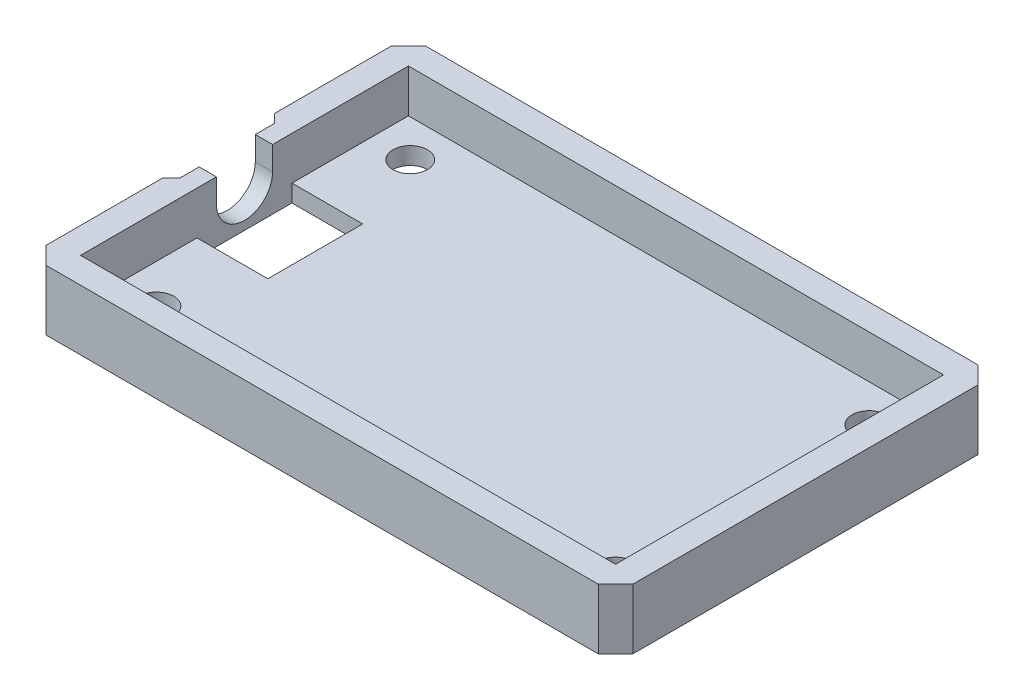
ISO-10303-21;
HEADER;
FILE_DESCRIPTION(('STEP AP214'),'2;1');
FILE_NAME('part.step','',(''),(''),'','','');
FILE_SCHEMA(('AUTOMOTIVE_DESIGN { 1 0 10303 214 1 1 1 1 }'));
ENDSEC;
DATA;
#1=APPLICATION_CONTEXT('core data for automotive mechanical design processes');
#2=APPLICATION_PROTOCOL_DEFINITION('international standard','automotive_design',2000,#1);
#3=PRODUCT_CONTEXT('',#1,'mechanical');
#4=PRODUCT('Part','Part','',(#3));
#5=PRODUCT_RELATED_PRODUCT_CATEGORY('part','',(#4));
#6=PRODUCT_DEFINITION_FORMATION('','',#4);
#7=PRODUCT_DEFINITION_CONTEXT('part definition',#1,'design');
#8=PRODUCT_DEFINITION('design','',#6,#7);
#9=PRODUCT_DEFINITION_SHAPE('','',#8);
#10=(LENGTH_UNIT() NAMED_UNIT(*) SI_UNIT(.MILLI.,.METRE.));
#11=(NAMED_UNIT(*) PLANE_ANGLE_UNIT() SI_UNIT($,.RADIAN.));
#12=(NAMED_UNIT(*) SI_UNIT($,.STERADIAN.) SOLID_ANGLE_UNIT());
#13=UNCERTAINTY_MEASURE_WITH_UNIT(LENGTH_MEASURE(1.E-05),#10,'distance_accuracy_value','');
#14=(GEOMETRIC_REPRESENTATION_CONTEXT(3) GLOBAL_UNCERTAINTY_ASSIGNED_CONTEXT((#13)) GLOBAL_UNIT_ASSIGNED_CONTEXT((#10,
#11,#12)) REPRESENTATION_CONTEXT('',''));
#15=CARTESIAN_POINT('',(0.,0.,0.));
#16=DIRECTION('',(0.,0.,1.));
#17=DIRECTION('',(1.,0.,0.));
#18=AXIS2_PLACEMENT_3D('',#15,#16,#17);
#19=CARTESIAN_POINT('',(-36.2840909090909,5.,14.3181818181818));
#20=DIRECTION('',(0.,0.,1.));
#21=DIRECTION('',(1.,0.,0.));
#22=AXIS2_PLACEMENT_3D('',#19,#20,#21);
#23=PLANE('',#22);
#24=DIRECTION('',(0.,-1.,0.));
#25=VECTOR('',#24,1.);
#26=CARTESIAN_POINT('',(-33.2840909090909,5.,14.3181818181818));
#27=LINE('',#26,#25);
#28=CARTESIAN_POINT('',(-33.2840909090909,0.,14.3181818181818));
#29=VERTEX_POINT('',#28);
#30=CARTESIAN_POINT('',(-33.2840909090909,-2.,14.3181818181818));
#31=VERTEX_POINT('',#30);
#32=EDGE_CURVE('E223',#29,#31,#27,.T.);
#33=ORIENTED_EDGE('',*,*,#32,.F.);
#34=DIRECTION('',(-1.,0.,0.));
#35=VECTOR('',#34,1.);
#36=CARTESIAN_POINT('',(-25.0840909090909,0.,14.3181818181818));
#37=LINE('',#36,#35);
#38=CARTESIAN_POINT('',(-25.0840909090909,0.,14.3181818181818));
#39=VERTEX_POINT('',#38);
#40=EDGE_CURVE('E269',#39,#29,#37,.T.);
#41=ORIENTED_EDGE('',*,*,#40,.F.);
#42=DIRECTION('',(0.,1.,0.));
#43=VECTOR('',#42,1.);
#44=CARTESIAN_POINT('',(-25.0840909090909,0.,14.3181818181818));
#45=LINE('',#44,#43);
#46=CARTESIAN_POINT('',(-25.0840909090909,-2.,14.3181818181818));
#47=VERTEX_POINT('',#46);
#48=EDGE_CURVE('E259',#47,#39,#45,.T.);
#49=ORIENTED_EDGE('',*,*,#48,.F.);
#50=DIRECTION('',(-1.,0.,0.));
#51=VECTOR('',#50,1.);
#52=CARTESIAN_POINT('',(-25.0840909090909,-2.,14.3181818181818));
#53=LINE('',#52,#51);
#54=EDGE_CURVE('E272',#47,#31,#53,.T.);
#55=ORIENTED_EDGE('',*,*,#54,.T.);
#56=EDGE_LOOP('',(#33,#41,#49,#55));
#57=FACE_BOUND('',#56,.T.);
#58=ADVANCED_FACE('F33',(#57),#23,.F.);
#59=CARTESIAN_POINT('',(-36.2840909090909,5.,3.31818181818182));
#60=DIRECTION('',(0.,0.,-1.));
#61=DIRECTION('',(-1.,0.,0.));
#62=AXIS2_PLACEMENT_3D('',#59,#60,#61);
#63=PLANE('',#62);
#64=DIRECTION('',(0.,1.,0.));
#65=VECTOR('',#64,1.);
#66=CARTESIAN_POINT('',(-33.2840909090909,5.,3.31818181818182));
#67=LINE('',#66,#65);
#68=CARTESIAN_POINT('',(-33.2840909090909,-2.,3.31818181818182));
#69=VERTEX_POINT('',#68);
#70=CARTESIAN_POINT('',(-33.2840909090909,0.,3.31818181818182));
#71=VERTEX_POINT('',#70);
#72=EDGE_CURVE('E236',#69,#71,#67,.T.);
#73=ORIENTED_EDGE('',*,*,#72,.F.);
#74=DIRECTION('',(-1.,0.,0.));
#75=VECTOR('',#74,1.);
#76=CARTESIAN_POINT('',(-25.0840909090909,-2.,3.31818181818182));
#77=LINE('',#76,#75);
#78=CARTESIAN_POINT('',(-25.0840909090909,-2.,3.31818181818182));
#79=VERTEX_POINT('',#78);
#80=EDGE_CURVE('E265',#79,#69,#77,.T.);
#81=ORIENTED_EDGE('',*,*,#80,.F.);
#82=DIRECTION('',(0.,-1.,0.));
#83=VECTOR('',#82,1.);
#84=CARTESIAN_POINT('',(-25.0840909090909,0.,3.31818181818182));
#85=LINE('',#84,#83);
#86=CARTESIAN_POINT('',(-25.0840909090909,0.,3.31818181818182));
#87=VERTEX_POINT('',#86);
#88=EDGE_CURVE('E254',#87,#79,#85,.T.);
#89=ORIENTED_EDGE('',*,*,#88,.F.);
#90=DIRECTION('',(-1.,0.,0.));
#91=VECTOR('',#90,1.);
#92=CARTESIAN_POINT('',(-25.0840909090909,0.,3.31818181818182));
#93=LINE('',#92,#91);
#94=EDGE_CURVE('E266',#87,#71,#93,.T.);
#95=ORIENTED_EDGE('',*,*,#94,.T.);
#96=EDGE_LOOP('',(#73,#81,#89,#95));
#97=FACE_BOUND('',#96,.T.);
#98=ADVANCED_FACE('F474',(#97),#63,.F.);
#99=CARTESIAN_POINT('',(-36.2840909090909,5.,-13.1818181818182));
#100=DIRECTION('',(1.,0.,0.));
#101=DIRECTION('',(0.,0.,-1.));
#102=AXIS2_PLACEMENT_3D('',#99,#100,#101);
#103=PLANE('',#102);
#104=DIRECTION('',(0.,0.,1.));
#105=VECTOR('',#104,1.);
#106=CARTESIAN_POINT('',(-36.2840909090909,5.,-13.1818181818182));
#107=LINE('',#106,#105);
#108=CARTESIAN_POINT('',(-36.2840909090909,5.,-11.1818181818182));
#109=VERTEX_POINT('',#108);
#110=CARTESIAN_POINT('',(-36.2840909090909,5.,2.3181818181818));
#111=VERTEX_POINT('',#110);
#112=EDGE_CURVE('E305',#109,#111,#107,.T.);
#113=ORIENTED_EDGE('',*,*,#112,.F.);
#114=DIRECTION('',(0.,-1.,0.));
#115=VECTOR('',#114,1.);
#116=CARTESIAN_POINT('',(-36.2840909090909,5.,-11.1818181818182));
#117=LINE('',#116,#115);
#118=CARTESIAN_POINT('',(-36.2840909090909,-2.,-11.1818181818182));
#119=VERTEX_POINT('',#118);
#120=EDGE_CURVE('E350',#109,#119,#117,.T.);
#121=ORIENTED_EDGE('',*,*,#120,.T.);
#122=DIRECTION('',(0.,0.,-1.));
#123=VECTOR('',#122,1.);
#124=CARTESIAN_POINT('',(-36.2840909090909,-2.,-13.1818181818182));
#125=LINE('',#124,#123);
#126=CARTESIAN_POINT('',(-36.2840909090909,-2.,2.3181818181818));
#127=VERTEX_POINT('',#126);
#128=EDGE_CURVE('E268',#127,#119,#125,.T.);
#129=ORIENTED_EDGE('',*,*,#128,.F.);
#130=DIRECTION('',(0.,1.,0.));
#131=VECTOR('',#130,1.);
#132=CARTESIAN_POINT('',(-36.2840909090909,5.,2.3181818181818));
#133=LINE('',#132,#131);
#134=EDGE_CURVE('E347',#127,#111,#133,.T.);
#135=ORIENTED_EDGE('',*,*,#134,.T.);
#136=EDGE_LOOP('',(#113,#121,#129,#135));
#137=FACE_BOUND('',#136,.T.);
#138=ADVANCED_FACE('F419',(#137),#103,.F.);
#139=CARTESIAN_POINT('',(-33.2840909090909,5.,-10.1818181818182));
#140=DIRECTION('',(0.,0.,-1.));
#141=DIRECTION('',(-1.,0.,0.));
#142=AXIS2_PLACEMENT_3D('',#139,#140,#141);
#143=PLANE('',#142);
#144=DIRECTION('',(1.,0.,0.));
#145=VECTOR('',#144,1.);
#146=CARTESIAN_POINT('',(-33.2840909090909,0.,-10.1818181818182));
#147=LINE('',#146,#145);
#148=CARTESIAN_POINT('',(-33.2840909090909,0.,-10.1818181818182));
#149=VERTEX_POINT('',#148);
#150=CARTESIAN_POINT('',(28.7159090909091,0.,-10.1818181818182));
#151=VERTEX_POINT('',#150);
#152=EDGE_CURVE('E309',#149,#151,#147,.T.);
#153=ORIENTED_EDGE('',*,*,#152,.T.);
#154=DIRECTION('',(0.,-1.,0.));
#155=VECTOR('',#154,1.);
#156=CARTESIAN_POINT('',(28.7159090909091,5.,-10.1818181818182));
#157=LINE('',#156,#155);
#158=CARTESIAN_POINT('',(28.7159090909091,5.,-10.1818181818182));
#159=VERTEX_POINT('',#158);
#160=EDGE_CURVE('E326',#159,#151,#157,.T.);
#161=ORIENTED_EDGE('',*,*,#160,.F.);
#162=DIRECTION('',(1.,0.,0.));
#163=VECTOR('',#162,1.);
#164=CARTESIAN_POINT('',(-33.2840909090909,5.,-10.1818181818182));
#165=LINE('',#164,#163);
#166=CARTESIAN_POINT('',(-33.2840909090909,5.,-10.1818181818182));
#167=VERTEX_POINT('',#166);
#168=EDGE_CURVE('E289',#167,#159,#165,.T.);
#169=ORIENTED_EDGE('',*,*,#168,.F.);
#170=DIRECTION('',(0.,-1.,0.));
#171=VECTOR('',#170,1.);
#172=CARTESIAN_POINT('',(-33.2840909090909,5.,-10.1818181818182));
#173=LINE('',#172,#171);
#174=EDGE_CURVE('E329',#167,#149,#173,.T.);
#175=ORIENTED_EDGE('',*,*,#174,.T.);
#176=EDGE_LOOP('',(#153,#161,#169,#175));
#177=FACE_BOUND('',#176,.T.);
#178=ADVANCED_FACE('F444',(#177),#143,.F.);
#179=CARTESIAN_POINT('',(28.7159090909091,5.,-10.1818181818182));
#180=DIRECTION('',(1.,0.,0.));
#181=DIRECTION('',(0.,0.,-1.));
#182=AXIS2_PLACEMENT_3D('',#179,#180,#181);
#183=PLANE('',#182);
#184=DIRECTION('',(0.,0.,1.));
#185=VECTOR('',#184,1.);
#186=CARTESIAN_POINT('',(28.7159090909091,0.,-10.1818181818182));
#187=LINE('',#186,#185);
#188=CARTESIAN_POINT('',(28.7159090909091,0.,27.8181818181818));
#189=VERTEX_POINT('',#188);
#190=EDGE_CURVE('E312',#151,#189,#187,.T.);
#191=ORIENTED_EDGE('',*,*,#190,.T.);
#192=DIRECTION('',(0.,-1.,0.));
#193=VECTOR('',#192,1.);
#194=CARTESIAN_POINT('',(28.7159090909091,5.,27.8181818181818));
#195=LINE('',#194,#193);
#196=CARTESIAN_POINT('',(28.7159090909091,5.,27.8181818181818));
#197=VERTEX_POINT('',#196);
#198=EDGE_CURVE('E323',#197,#189,#195,.T.);
#199=ORIENTED_EDGE('',*,*,#198,.F.);
#200=DIRECTION('',(0.,0.,1.));
#201=VECTOR('',#200,1.);
#202=CARTESIAN_POINT('',(28.7159090909091,5.,-10.1818181818182));
#203=LINE('',#202,#201);
#204=EDGE_CURVE('E292',#159,#197,#203,.T.);
#205=ORIENTED_EDGE('',*,*,#204,.F.);
#206=ORIENTED_EDGE('',*,*,#160,.T.);
#207=EDGE_LOOP('',(#191,#199,#205,#206));
#208=FACE_BOUND('',#207,.T.);
#209=ADVANCED_FACE('F451',(#208),#183,.F.);
#210=CARTESIAN_POINT('',(-33.2840909090909,5.,27.8181818181818));
#211=DIRECTION('',(0.,0.,1.));
#212=DIRECTION('',(1.,0.,0.));
#213=AXIS2_PLACEMENT_3D('',#210,#211,#212);
#214=PLANE('',#213);
#215=DIRECTION('',(-1.,0.,0.));
#216=VECTOR('',#215,1.);
#217=CARTESIAN_POINT('',(-33.2840909090909,0.,27.8181818181818));
#218=LINE('',#217,#216);
#219=CARTESIAN_POINT('',(-33.2840909090909,0.,27.8181818181818));
#220=VERTEX_POINT('',#219);
#221=EDGE_CURVE('E315',#189,#220,#218,.T.);
#222=ORIENTED_EDGE('',*,*,#221,.T.);
#223=DIRECTION('',(0.,-1.,0.));
#224=VECTOR('',#223,1.);
#225=CARTESIAN_POINT('',(-33.2840909090909,5.,27.8181818181818));
#226=LINE('',#225,#224);
#227=CARTESIAN_POINT('',(-33.2840909090909,5.,27.8181818181818));
#228=VERTEX_POINT('',#227);
#229=EDGE_CURVE('E307',#228,#220,#226,.T.);
#230=ORIENTED_EDGE('',*,*,#229,.F.);
#231=DIRECTION('',(-1.,0.,0.));
#232=VECTOR('',#231,1.);
#233=CARTESIAN_POINT('',(-33.2840909090909,5.,27.8181818181818));
#234=LINE('',#233,#232);
#235=EDGE_CURVE('E294',#197,#228,#234,.T.);
#236=ORIENTED_EDGE('',*,*,#235,.F.);
#237=ORIENTED_EDGE('',*,*,#198,.T.);
#238=EDGE_LOOP('',(#222,#230,#236,#237));
#239=FACE_BOUND('',#238,.T.);
#240=ADVANCED_FACE('F453',(#239),#214,.F.);
#241=CARTESIAN_POINT('',(-33.2840909090909,5.,14.3181818181818));
#242=DIRECTION('',(-1.,0.,0.));
#243=DIRECTION('',(0.,0.,1.));
#244=AXIS2_PLACEMENT_3D('',#241,#242,#243);
#245=PLANE('',#244);
#246=DIRECTION('',(0.,0.,-1.));
#247=VECTOR('',#246,1.);
#248=CARTESIAN_POINT('',(-33.2840909090909,5.,-10.1818181818182));
#249=LINE('',#248,#247);
#250=CARTESIAN_POINT('',(-33.2840909090909,5.,5.56818181818181));
#251=VERTEX_POINT('',#250);
#252=EDGE_CURVE('E290',#251,#167,#249,.T.);
#253=ORIENTED_EDGE('',*,*,#252,.F.);
#254=DIRECTION('',(0.,-1.,0.));
#255=VECTOR('',#254,1.);
#256=CARTESIAN_POINT('',(-33.2840909090909,5.,5.56818181818181));
#257=LINE('',#256,#255);
#258=CARTESIAN_POINT('',(-33.2840909090909,2.25,5.56818181818181));
#259=VERTEX_POINT('',#258);
#260=EDGE_CURVE('E440',#251,#259,#257,.T.);
#261=ORIENTED_EDGE('',*,*,#260,.T.);
#262=CARTESIAN_POINT('',(-33.2840909090909,2.25,8.81818181818181));
#263=DIRECTION('',(-1.,0.,0.));
#264=DIRECTION('',(0.,0.,1.));
#265=AXIS2_PLACEMENT_3D('',#262,#263,#264);
#266=CIRCLE('',#265,3.25);
#267=CARTESIAN_POINT('',(-33.2840909090909,2.25,12.0681818181818));
#268=VERTEX_POINT('',#267);
#269=EDGE_CURVE('E228',#259,#268,#266,.T.);
#270=ORIENTED_EDGE('',*,*,#269,.T.);
#271=DIRECTION('',(0.,1.,0.));
#272=VECTOR('',#271,1.);
#273=CARTESIAN_POINT('',(-33.2840909090909,5.,12.0681818181818));
#274=LINE('',#273,#272);
#275=CARTESIAN_POINT('',(-33.2840909090909,5.,12.0681818181818));
#276=VERTEX_POINT('',#275);
#277=EDGE_CURVE('E454',#268,#276,#274,.T.);
#278=ORIENTED_EDGE('',*,*,#277,.T.);
#279=EDGE_CURVE('E214',#228,#276,#249,.T.);
#280=ORIENTED_EDGE('',*,*,#279,.F.);
#281=ORIENTED_EDGE('',*,*,#229,.T.);
#282=DIRECTION('',(0.,0.,-1.));
#283=VECTOR('',#282,1.);
#284=CARTESIAN_POINT('',(-33.2840909090909,0.,14.3181818181818));
#285=LINE('',#284,#283);
#286=EDGE_CURVE('E318',#220,#29,#285,.T.);
#287=ORIENTED_EDGE('',*,*,#286,.T.);
#288=ORIENTED_EDGE('',*,*,#32,.T.);
#289=DIRECTION('',(0.,0.,1.));
#290=VECTOR('',#289,1.);
#291=CARTESIAN_POINT('',(-33.2840909090909,-2.,-5.68181818181819));
#292=LINE('',#291,#290);
#293=EDGE_CURVE('E233',#69,#31,#292,.T.);
#294=ORIENTED_EDGE('',*,*,#293,.F.);
#295=ORIENTED_EDGE('',*,*,#72,.T.);
#296=DIRECTION('',(0.,0.,-1.));
#297=VECTOR('',#296,1.);
#298=CARTESIAN_POINT('',(-33.2840909090909,0.,-10.1818181818182));
#299=LINE('',#298,#297);
#300=EDGE_CURVE('E287',#71,#149,#299,.T.);
#301=ORIENTED_EDGE('',*,*,#300,.T.);
#302=ORIENTED_EDGE('',*,*,#174,.F.);
#303=EDGE_LOOP('',(#253,#261,#270,#278,#280,#281,#287,#288,#294,#295,#301,#302));
#304=FACE_BOUND('',#303,.T.);
#305=ADVANCED_FACE('F438',(#304),#245,.F.);
#306=CARTESIAN_POINT('',(-36.2840909090909,5.,30.8181818181818));
#307=DIRECTION('',(0.,0.,-1.));
#308=DIRECTION('',(-1.,0.,0.));
#309=AXIS2_PLACEMENT_3D('',#306,#307,#308);
#310=PLANE('',#309);
#311=DIRECTION('',(-1.,0.,0.));
#312=VECTOR('',#311,1.);
#313=CARTESIAN_POINT('',(-36.2840909090909,-2.,30.8181818181818));
#314=LINE('',#313,#312);
#315=CARTESIAN_POINT('',(29.7159090909091,-2.,30.8181818181818));
#316=VERTEX_POINT('',#315);
#317=CARTESIAN_POINT('',(-34.2840909090909,-2.,30.8181818181818));
#318=VERTEX_POINT('',#317);
#319=EDGE_CURVE('E284',#316,#318,#314,.T.);
#320=ORIENTED_EDGE('',*,*,#319,.F.);
#321=DIRECTION('',(0.,1.,0.));
#322=VECTOR('',#321,1.);
#323=CARTESIAN_POINT('',(29.7159090909091,5.,30.8181818181818));
#324=LINE('',#323,#322);
#325=CARTESIAN_POINT('',(29.7159090909091,5.,30.8181818181818));
#326=VERTEX_POINT('',#325);
#327=EDGE_CURVE('E41',#316,#326,#324,.T.);
#328=ORIENTED_EDGE('',*,*,#327,.T.);
#329=DIRECTION('',(1.,0.,0.));
#330=VECTOR('',#329,1.);
#331=CARTESIAN_POINT('',(-36.2840909090909,5.,30.8181818181818));
#332=LINE('',#331,#330);
#333=CARTESIAN_POINT('',(-34.2840909090909,5.,30.8181818181818));
#334=VERTEX_POINT('',#333);
#335=EDGE_CURVE('E299',#334,#326,#332,.T.);
#336=ORIENTED_EDGE('',*,*,#335,.F.);
#337=DIRECTION('',(0.,-1.,0.));
#338=VECTOR('',#337,1.);
#339=CARTESIAN_POINT('',(-34.2840909090909,5.,30.8181818181818));
#340=LINE('',#339,#338);
#341=EDGE_CURVE('E386',#334,#318,#340,.T.);
#342=ORIENTED_EDGE('',*,*,#341,.T.);
#343=EDGE_LOOP('',(#320,#328,#336,#342));
#344=FACE_BOUND('',#343,.T.);
#345=ADVANCED_FACE('F392',(#344),#310,.F.);
#346=CARTESIAN_POINT('',(31.7159090909091,5.,-13.1818181818182));
#347=DIRECTION('',(-1.,0.,0.));
#348=DIRECTION('',(0.,0.,1.));
#349=AXIS2_PLACEMENT_3D('',#346,#347,#348);
#350=PLANE('',#349);
#351=DIRECTION('',(0.,0.,1.));
#352=VECTOR('',#351,1.);
#353=CARTESIAN_POINT('',(31.7159090909091,-2.,-13.1818181818182));
#354=LINE('',#353,#352);
#355=CARTESIAN_POINT('',(31.7159090909091,-2.,-11.1818181818182));
#356=VERTEX_POINT('',#355);
#357=CARTESIAN_POINT('',(31.7159090909091,-2.,28.8181818181818));
#358=VERTEX_POINT('',#357);
#359=EDGE_CURVE('E281',#356,#358,#354,.T.);
#360=ORIENTED_EDGE('',*,*,#359,.F.);
#361=DIRECTION('',(0.,1.,0.));
#362=VECTOR('',#361,1.);
#363=CARTESIAN_POINT('',(31.7159090909091,5.,-11.1818181818182));
#364=LINE('',#363,#362);
#365=CARTESIAN_POINT('',(31.7159090909091,5.,-11.1818181818182));
#366=VERTEX_POINT('',#365);
#367=EDGE_CURVE('E48',#356,#366,#364,.T.);
#368=ORIENTED_EDGE('',*,*,#367,.T.);
#369=DIRECTION('',(0.,0.,-1.));
#370=VECTOR('',#369,1.);
#371=CARTESIAN_POINT('',(31.7159090909091,5.,-13.1818181818182));
#372=LINE('',#371,#370);
#373=CARTESIAN_POINT('',(31.7159090909091,5.,28.8181818181818));
#374=VERTEX_POINT('',#373);
#375=EDGE_CURVE('E301',#374,#366,#372,.T.);
#376=ORIENTED_EDGE('',*,*,#375,.F.);
#377=DIRECTION('',(0.,-1.,0.));
#378=VECTOR('',#377,1.);
#379=CARTESIAN_POINT('',(31.7159090909091,5.,28.8181818181818));
#380=LINE('',#379,#378);
#381=EDGE_CURVE('E382',#374,#358,#380,.T.);
#382=ORIENTED_EDGE('',*,*,#381,.T.);
#383=EDGE_LOOP('',(#360,#368,#376,#382));
#384=FACE_BOUND('',#383,.T.);
#385=ADVANCED_FACE('F398',(#384),#350,.F.);
#386=CARTESIAN_POINT('',(-36.2840909090909,5.,-13.1818181818182));
#387=DIRECTION('',(0.,0.,1.));
#388=DIRECTION('',(1.,0.,0.));
#389=AXIS2_PLACEMENT_3D('',#386,#387,#388);
#390=PLANE('',#389);
#391=DIRECTION('',(1.,0.,0.));
#392=VECTOR('',#391,1.);
#393=CARTESIAN_POINT('',(-36.2840909090909,-2.,-13.1818181818182));
#394=LINE('',#393,#392);
#395=CARTESIAN_POINT('',(-34.2840909090909,-2.,-13.1818181818182));
#396=VERTEX_POINT('',#395);
#397=CARTESIAN_POINT('',(29.7159090909091,-2.,-13.1818181818182));
#398=VERTEX_POINT('',#397);
#399=EDGE_CURVE('E278',#396,#398,#394,.T.);
#400=ORIENTED_EDGE('',*,*,#399,.F.);
#401=DIRECTION('',(0.,1.,0.));
#402=VECTOR('',#401,1.);
#403=CARTESIAN_POINT('',(-34.2840909090909,5.,-13.1818181818182));
#404=LINE('',#403,#402);
#405=CARTESIAN_POINT('',(-34.2840909090909,5.,-13.1818181818182));
#406=VERTEX_POINT('',#405);
#407=EDGE_CURVE('E373',#396,#406,#404,.T.);
#408=ORIENTED_EDGE('',*,*,#407,.T.);
#409=DIRECTION('',(-1.,0.,0.));
#410=VECTOR('',#409,1.);
#411=CARTESIAN_POINT('',(-36.2840909090909,5.,-13.1818181818182));
#412=LINE('',#411,#410);
#413=CARTESIAN_POINT('',(29.7159090909091,5.,-13.1818181818182));
#414=VERTEX_POINT('',#413);
#415=EDGE_CURVE('E303',#414,#406,#412,.T.);
#416=ORIENTED_EDGE('',*,*,#415,.F.);
#417=DIRECTION('',(0.,-1.,0.));
#418=VECTOR('',#417,1.);
#419=CARTESIAN_POINT('',(29.7159090909091,5.,-13.1818181818182));
#420=LINE('',#419,#418);
#421=EDGE_CURVE('E370',#414,#398,#420,.T.);
#422=ORIENTED_EDGE('',*,*,#421,.T.);
#423=EDGE_LOOP('',(#400,#408,#416,#422));
#424=FACE_BOUND('',#423,.T.);
#425=ADVANCED_FACE('F410',(#424),#390,.F.);
#426=CARTESIAN_POINT('',(-36.2840909090909,-2.,28.8181818181818));
#427=VERTEX_POINT('',#426);
#428=CARTESIAN_POINT('',(-36.2840909090909,-2.,15.3181818181818));
#429=VERTEX_POINT('',#428);
#430=EDGE_CURVE('E276',#427,#429,#125,.T.);
#431=ORIENTED_EDGE('',*,*,#430,.F.);
#432=DIRECTION('',(0.,1.,0.));
#433=VECTOR('',#432,1.);
#434=CARTESIAN_POINT('',(-36.2840909090909,5.,28.8181818181818));
#435=LINE('',#434,#433);
#436=CARTESIAN_POINT('',(-36.2840909090909,5.,28.8181818181818));
#437=VERTEX_POINT('',#436);
#438=EDGE_CURVE('E11',#427,#437,#435,.T.);
#439=ORIENTED_EDGE('',*,*,#438,.T.);
#440=DIRECTION('',(0.,0.,1.));
#441=VECTOR('',#440,1.);
#442=CARTESIAN_POINT('',(-36.2840909090909,5.,14.3181818181818));
#443=LINE('',#442,#441);
#444=CARTESIAN_POINT('',(-36.2840909090909,5.,15.3181818181818));
#445=VERTEX_POINT('',#444);
#446=EDGE_CURVE('E296',#445,#437,#443,.T.);
#447=ORIENTED_EDGE('',*,*,#446,.F.);
#448=DIRECTION('',(0.,-1.,0.));
#449=VECTOR('',#448,1.);
#450=CARTESIAN_POINT('',(-36.2840909090909,5.,15.3181818181818));
#451=LINE('',#450,#449);
#452=EDGE_CURVE('E332',#445,#429,#451,.T.);
#453=ORIENTED_EDGE('',*,*,#452,.T.);
#454=EDGE_LOOP('',(#431,#439,#447,#453));
#455=FACE_BOUND('',#454,.T.);
#456=ADVANCED_FACE('F515',(#455),#103,.F.);
#457=CARTESIAN_POINT('',(0.,5.,0.));
#458=DIRECTION('',(0.,1.,0.));
#459=DIRECTION('',(0.,0.,1.));
#460=AXIS2_PLACEMENT_3D('',#457,#458,#459);
#461=PLANE('',#460);
#462=ORIENTED_EDGE('',*,*,#415,.T.);
#463=DIRECTION('',(0.707106781186548,0.,-0.707106781186548));
#464=VECTOR('',#463,1.);
#465=CARTESIAN_POINT('',(-23.7329545454545,5.,-23.7329545454545));
#466=LINE('',#465,#464);
#467=EDGE_CURVE('E380',#406,#109,#466,.F.);
#468=ORIENTED_EDGE('',*,*,#467,.T.);
#469=ORIENTED_EDGE('',*,*,#112,.T.);
#470=DIRECTION('',(-0.707106781186543,0.,-0.707106781186552));
#471=VECTOR('',#470,1.);
#472=CARTESIAN_POINT('',(-19.3011363636366,5.,19.3011363636363));
#473=LINE('',#472,#471);
#474=CARTESIAN_POINT('',(-35.2840909090909,5.,3.31818181818182));
#475=VERTEX_POINT('',#474);
#476=EDGE_CURVE('E340',#111,#475,#473,.F.);
#477=ORIENTED_EDGE('',*,*,#476,.T.);
#478=DIRECTION('',(0.,0.,1.));
#479=VECTOR('',#478,1.);
#480=CARTESIAN_POINT('',(-35.2840909090909,5.,-5.68181818181819));
#481=LINE('',#480,#479);
#482=CARTESIAN_POINT('',(-35.2840909090909,5.,5.56818181818181));
#483=VERTEX_POINT('',#482);
#484=EDGE_CURVE('E222',#475,#483,#481,.T.);
#485=ORIENTED_EDGE('',*,*,#484,.T.);
#486=DIRECTION('',(-1.,0.,0.));
#487=VECTOR('',#486,1.);
#488=CARTESIAN_POINT('',(-30.2840909090909,5.,5.56818181818181));
#489=LINE('',#488,#487);
#490=EDGE_CURVE('E215',#251,#483,#489,.T.);
#491=ORIENTED_EDGE('',*,*,#490,.F.);
#492=ORIENTED_EDGE('',*,*,#252,.T.);
#493=ORIENTED_EDGE('',*,*,#168,.T.);
#494=ORIENTED_EDGE('',*,*,#204,.T.);
#495=ORIENTED_EDGE('',*,*,#235,.T.);
#496=ORIENTED_EDGE('',*,*,#279,.T.);
#497=DIRECTION('',(-1.,0.,0.));
#498=VECTOR('',#497,1.);
#499=CARTESIAN_POINT('',(-30.2840909090909,5.,12.0681818181818));
#500=LINE('',#499,#498);
#501=CARTESIAN_POINT('',(-35.2840909090909,5.,12.0681818181818));
#502=VERTEX_POINT('',#501);
#503=EDGE_CURVE('E198',#276,#502,#500,.T.);
#504=ORIENTED_EDGE('',*,*,#503,.T.);
#505=CARTESIAN_POINT('',(-35.2840909090909,5.,14.3181818181818));
#506=VERTEX_POINT('',#505);
#507=EDGE_CURVE('E211',#502,#506,#481,.T.);
#508=ORIENTED_EDGE('',*,*,#507,.T.);
#509=DIRECTION('',(0.707106781186548,0.,-0.707106781186547));
#510=VECTOR('',#509,1.);
#511=CARTESIAN_POINT('',(-10.4829545454545,5.,-10.4829545454545));
#512=LINE('',#511,#510);
#513=EDGE_CURVE('E342',#506,#445,#512,.F.);
#514=ORIENTED_EDGE('',*,*,#513,.T.);
#515=ORIENTED_EDGE('',*,*,#446,.T.);
#516=DIRECTION('',(-0.707106781186548,0.,-0.707106781186548));
#517=VECTOR('',#516,1.);
#518=CARTESIAN_POINT('',(-32.5511363636364,5.,32.5511363636364));
#519=LINE('',#518,#517);
#520=EDGE_CURVE('E375',#437,#334,#519,.F.);
#521=ORIENTED_EDGE('',*,*,#520,.T.);
#522=ORIENTED_EDGE('',*,*,#335,.T.);
#523=DIRECTION('',(-0.707106781186549,0.,0.707106781186546));
#524=VECTOR('',#523,1.);
#525=CARTESIAN_POINT('',(30.2670454545454,5.,30.2670454545455));
#526=LINE('',#525,#524);
#527=EDGE_CURVE('E55',#326,#374,#526,.F.);
#528=ORIENTED_EDGE('',*,*,#527,.T.);
#529=ORIENTED_EDGE('',*,*,#375,.T.);
#530=DIRECTION('',(0.707106781186548,0.,0.707106781186548));
#531=VECTOR('',#530,1.);
#532=CARTESIAN_POINT('',(21.4488636363636,5.,-21.4488636363636));
#533=LINE('',#532,#531);
#534=EDGE_CURVE('E378',#366,#414,#533,.F.);
#535=ORIENTED_EDGE('',*,*,#534,.T.);
#536=EDGE_LOOP('',(#462,#468,#469,#477,#485,#491,#492,#493,#494,#495,#496,#504,#508,#514,#515,
#521,#522,#528,#529,#535));
#537=FACE_BOUND('',#536,.T.);
#538=ADVANCED_FACE('F210',(#537),#461,.T.);
#539=CARTESIAN_POINT('',(0.,0.,0.));
#540=DIRECTION('',(0.,1.,0.));
#541=DIRECTION('',(0.,0.,1.));
#542=AXIS2_PLACEMENT_3D('',#539,#540,#541);
#543=PLANE('',#542);
#544=CARTESIAN_POINT('',(24.4159090909091,0.,23.5181818181818));
#545=DIRECTION('',(0.,1.,0.));
#546=DIRECTION('',(0.,0.,1.));
#547=AXIS2_PLACEMENT_3D('',#544,#545,#546);
#548=CIRCLE('',#547,2.);
#549=CARTESIAN_POINT('',(24.4159090909091,0.,25.5181818181818));
#550=VERTEX_POINT('',#549);
#551=EDGE_CURVE('E240',#550,#550,#548,.T.);
#552=ORIENTED_EDGE('',*,*,#551,.F.);
#553=EDGE_LOOP('',(#552));
#554=FACE_BOUND('',#553,.T.);
#555=CARTESIAN_POINT('',(-28.7840909090909,0.,23.5181818181818));
#556=DIRECTION('',(0.,1.,0.));
#557=DIRECTION('',(0.,0.,1.));
#558=AXIS2_PLACEMENT_3D('',#555,#556,#557);
#559=CIRCLE('',#558,2.00000000000001);
#560=CARTESIAN_POINT('',(-28.7840909090909,0.,25.5181818181818));
#561=VERTEX_POINT('',#560);
#562=EDGE_CURVE('E244',#561,#561,#559,.T.);
#563=ORIENTED_EDGE('',*,*,#562,.F.);
#564=EDGE_LOOP('',(#563));
#565=FACE_BOUND('',#564,.T.);
#566=CARTESIAN_POINT('',(-28.7840909090909,0.,-5.88181818181818));
#567=DIRECTION('',(0.,1.,0.));
#568=DIRECTION('',(0.,0.,1.));
#569=AXIS2_PLACEMENT_3D('',#566,#567,#568);
#570=CIRCLE('',#569,2.);
#571=CARTESIAN_POINT('',(-28.7840909090909,0.,-3.88181818181818));
#572=VERTEX_POINT('',#571);
#573=EDGE_CURVE('E239',#572,#572,#570,.T.);
#574=ORIENTED_EDGE('',*,*,#573,.F.);
#575=EDGE_LOOP('',(#574));
#576=FACE_BOUND('',#575,.T.);
#577=CARTESIAN_POINT('',(24.4159090909091,0.,-5.88181818181818));
#578=DIRECTION('',(0.,1.,0.));
#579=DIRECTION('',(0.,0.,1.));
#580=AXIS2_PLACEMENT_3D('',#577,#578,#579);
#581=CIRCLE('',#580,2.);
#582=CARTESIAN_POINT('',(24.4159090909091,0.,-3.88181818181818));
#583=VERTEX_POINT('',#582);
#584=EDGE_CURVE('E249',#583,#583,#581,.T.);
#585=ORIENTED_EDGE('',*,*,#584,.F.);
#586=EDGE_LOOP('',(#585));
#587=FACE_BOUND('',#586,.T.);
#588=ORIENTED_EDGE('',*,*,#94,.F.);
#589=DIRECTION('',(0.,0.,-1.));
#590=VECTOR('',#589,1.);
#591=CARTESIAN_POINT('',(-25.0840909090909,0.,3.31818181818182));
#592=LINE('',#591,#590);
#593=EDGE_CURVE('E262',#39,#87,#592,.T.);
#594=ORIENTED_EDGE('',*,*,#593,.F.);
#595=ORIENTED_EDGE('',*,*,#40,.T.);
#596=ORIENTED_EDGE('',*,*,#286,.F.);
#597=ORIENTED_EDGE('',*,*,#221,.F.);
#598=ORIENTED_EDGE('',*,*,#190,.F.);
#599=ORIENTED_EDGE('',*,*,#152,.F.);
#600=ORIENTED_EDGE('',*,*,#300,.F.);
#601=EDGE_LOOP('',(#588,#594,#595,#596,#597,#598,#599,#600));
#602=FACE_BOUND('',#601,.T.);
#603=ADVANCED_FACE('F524',(#554,#565,#576,#587,#602),#543,.T.);
#604=CARTESIAN_POINT('',(0.,-2.,0.));
#605=DIRECTION('',(0.,1.,0.));
#606=DIRECTION('',(0.,0.,1.));
#607=AXIS2_PLACEMENT_3D('',#604,#605,#606);
#608=PLANE('',#607);
#609=ORIENTED_EDGE('',*,*,#128,.T.);
#610=DIRECTION('',(-0.707106781186548,0.,0.707106781186548));
#611=VECTOR('',#610,1.);
#612=CARTESIAN_POINT('',(-36.2840909090909,-2.,-11.1818181818182));
#613=LINE('',#612,#611);
#614=EDGE_CURVE('E368',#119,#396,#613,.F.);
#615=ORIENTED_EDGE('',*,*,#614,.T.);
#616=ORIENTED_EDGE('',*,*,#399,.T.);
#617=DIRECTION('',(-0.707106781186548,0.,-0.707106781186548));
#618=VECTOR('',#617,1.);
#619=CARTESIAN_POINT('',(29.7159090909091,-2.,-13.1818181818182));
#620=LINE('',#619,#618);
#621=EDGE_CURVE('E366',#398,#356,#620,.F.);
#622=ORIENTED_EDGE('',*,*,#621,.T.);
#623=ORIENTED_EDGE('',*,*,#359,.T.);
#624=DIRECTION('',(0.707106781186549,0.,-0.707106781186546));
#625=VECTOR('',#624,1.);
#626=CARTESIAN_POINT('',(31.7159090909091,-2.,28.8181818181818));
#627=LINE('',#626,#625);
#628=EDGE_CURVE('E364',#358,#316,#627,.F.);
#629=ORIENTED_EDGE('',*,*,#628,.T.);
#630=ORIENTED_EDGE('',*,*,#319,.T.);
#631=DIRECTION('',(0.707106781186548,0.,0.707106781186548));
#632=VECTOR('',#631,1.);
#633=CARTESIAN_POINT('',(-34.2840909090909,-2.,30.8181818181818));
#634=LINE('',#633,#632);
#635=EDGE_CURVE('E362',#318,#427,#634,.F.);
#636=ORIENTED_EDGE('',*,*,#635,.T.);
#637=ORIENTED_EDGE('',*,*,#430,.T.);
#638=DIRECTION('',(-0.707106781186548,0.,0.707106781186547));
#639=VECTOR('',#638,1.);
#640=CARTESIAN_POINT('',(-36.2840909090909,-2.,15.3181818181818));
#641=LINE('',#640,#639);
#642=CARTESIAN_POINT('',(-35.2840909090909,-2.,14.3181818181818));
#643=VERTEX_POINT('',#642);
#644=EDGE_CURVE('E337',#429,#643,#641,.F.);
#645=ORIENTED_EDGE('',*,*,#644,.T.);
#646=DIRECTION('',(0.,0.,1.));
#647=VECTOR('',#646,1.);
#648=CARTESIAN_POINT('',(-35.2840909090909,-2.,-5.68181818181819));
#649=LINE('',#648,#647);
#650=CARTESIAN_POINT('',(-35.2840909090909,-2.,3.31818181818182));
#651=VERTEX_POINT('',#650);
#652=EDGE_CURVE('E226',#651,#643,#649,.T.);
#653=ORIENTED_EDGE('',*,*,#652,.F.);
#654=DIRECTION('',(0.707106781186543,0.,0.707106781186552));
#655=VECTOR('',#654,1.);
#656=CARTESIAN_POINT('',(-35.2840909090909,-2.,3.31818181818182));
#657=LINE('',#656,#655);
#658=EDGE_CURVE('E335',#651,#127,#657,.F.);
#659=ORIENTED_EDGE('',*,*,#658,.T.);
#660=EDGE_LOOP('',(#609,#615,#616,#622,#623,#629,#630,#636,#637,#645,#653,#659));
#661=FACE_BOUND('',#660,.T.);
#662=ORIENTED_EDGE('',*,*,#80,.T.);
#663=ORIENTED_EDGE('',*,*,#293,.T.);
#664=ORIENTED_EDGE('',*,*,#54,.F.);
#665=DIRECTION('',(0.,0.,1.));
#666=VECTOR('',#665,1.);
#667=CARTESIAN_POINT('',(-25.0840909090909,-2.,3.31818181818182));
#668=LINE('',#667,#666);
#669=EDGE_CURVE('E256',#79,#47,#668,.T.);
#670=ORIENTED_EDGE('',*,*,#669,.F.);
#671=EDGE_LOOP('',(#662,#663,#664,#670));
#672=FACE_BOUND('',#671,.T.);
#673=CARTESIAN_POINT('',(24.4159090909091,-2.,-5.88181818181818));
#674=DIRECTION('',(0.,1.,0.));
#675=DIRECTION('',(0.,0.,1.));
#676=AXIS2_PLACEMENT_3D('',#673,#674,#675);
#677=CIRCLE('',#676,2.);
#678=CARTESIAN_POINT('',(24.4159090909091,-2.,-3.88181818181818));
#679=VERTEX_POINT('',#678);
#680=EDGE_CURVE('E252',#679,#679,#677,.T.);
#681=ORIENTED_EDGE('',*,*,#680,.T.);
#682=EDGE_LOOP('',(#681));
#683=FACE_BOUND('',#682,.T.);
#684=CARTESIAN_POINT('',(-28.7840909090909,-2.,-5.88181818181818));
#685=DIRECTION('',(0.,1.,0.));
#686=DIRECTION('',(0.,0.,1.));
#687=AXIS2_PLACEMENT_3D('',#684,#685,#686);
#688=CIRCLE('',#687,2.);
#689=CARTESIAN_POINT('',(-28.7840909090909,-2.,-3.88181818181818));
#690=VERTEX_POINT('',#689);
#691=EDGE_CURVE('E243',#690,#690,#688,.T.);
#692=ORIENTED_EDGE('',*,*,#691,.T.);
#693=EDGE_LOOP('',(#692));
#694=FACE_BOUND('',#693,.T.);
#695=CARTESIAN_POINT('',(-28.7840909090909,-2.,23.5181818181818));
#696=DIRECTION('',(0.,1.,0.));
#697=DIRECTION('',(0.,0.,1.));
#698=AXIS2_PLACEMENT_3D('',#695,#696,#697);
#699=CIRCLE('',#698,2.00000000000001);
#700=CARTESIAN_POINT('',(-28.7840909090909,-2.,25.5181818181818));
#701=VERTEX_POINT('',#700);
#702=EDGE_CURVE('E355',#701,#701,#699,.T.);
#703=ORIENTED_EDGE('',*,*,#702,.T.);
#704=EDGE_LOOP('',(#703));
#705=FACE_BOUND('',#704,.T.);
#706=CARTESIAN_POINT('',(24.4159090909091,-2.,23.5181818181818));
#707=DIRECTION('',(0.,1.,0.));
#708=DIRECTION('',(0.,0.,1.));
#709=AXIS2_PLACEMENT_3D('',#706,#707,#708);
#710=CIRCLE('',#709,2.);
#711=CARTESIAN_POINT('',(24.4159090909091,-2.,25.5181818181818));
#712=VERTEX_POINT('',#711);
#713=EDGE_CURVE('E253',#712,#712,#710,.T.);
#714=ORIENTED_EDGE('',*,*,#713,.T.);
#715=EDGE_LOOP('',(#714));
#716=FACE_BOUND('',#715,.T.);
#717=ADVANCED_FACE('F401',(#661,#672,#683,#694,#705,#716),#608,.F.);
#718=CARTESIAN_POINT('',(-25.0840909090909,0.,0.));
#719=DIRECTION('',(-1.,0.,0.));
#720=DIRECTION('',(0.,0.,1.));
#721=AXIS2_PLACEMENT_3D('',#718,#719,#720);
#722=PLANE('',#721);
#723=ORIENTED_EDGE('',*,*,#88,.T.);
#724=ORIENTED_EDGE('',*,*,#669,.T.);
#725=ORIENTED_EDGE('',*,*,#48,.T.);
#726=ORIENTED_EDGE('',*,*,#593,.T.);
#727=EDGE_LOOP('',(#723,#724,#725,#726));
#728=FACE_BOUND('',#727,.T.);
#729=ADVANCED_FACE('F496',(#728),#722,.T.);
#730=CARTESIAN_POINT('',(-36.2840909090909,5.,15.3181818181818));
#731=DIRECTION('',(0.707106781186547,0.,0.707106781186548));
#732=DIRECTION('',(0.,-1.,0.));
#733=AXIS2_PLACEMENT_3D('',#730,#731,#732);
#734=PLANE('',#733);
#735=ORIENTED_EDGE('',*,*,#513,.F.);
#736=DIRECTION('',(0.,1.,0.));
#737=VECTOR('',#736,1.);
#738=CARTESIAN_POINT('',(-35.2840909090909,5.,14.3181818181818));
#739=LINE('',#738,#737);
#740=EDGE_CURVE('E221',#643,#506,#739,.T.);
#741=ORIENTED_EDGE('',*,*,#740,.F.);
#742=ORIENTED_EDGE('',*,*,#644,.F.);
#743=ORIENTED_EDGE('',*,*,#452,.F.);
#744=EDGE_LOOP('',(#735,#741,#742,#743));
#745=FACE_BOUND('',#744,.T.);
#746=ADVANCED_FACE('F493',(#745),#734,.F.);
#747=CARTESIAN_POINT('',(-35.2840909090909,5.,3.31818181818182));
#748=DIRECTION('',(0.707106781186552,0.,-0.707106781186542));
#749=DIRECTION('',(0.,-1.,0.));
#750=AXIS2_PLACEMENT_3D('',#747,#748,#749);
#751=PLANE('',#750);
#752=ORIENTED_EDGE('',*,*,#476,.F.);
#753=ORIENTED_EDGE('',*,*,#134,.F.);
#754=ORIENTED_EDGE('',*,*,#658,.F.);
#755=DIRECTION('',(0.,-1.,0.));
#756=VECTOR('',#755,1.);
#757=CARTESIAN_POINT('',(-35.2840909090909,5.,3.31818181818182));
#758=LINE('',#757,#756);
#759=EDGE_CURVE('E344',#475,#651,#758,.T.);
#760=ORIENTED_EDGE('',*,*,#759,.F.);
#761=EDGE_LOOP('',(#752,#753,#754,#760));
#762=FACE_BOUND('',#761,.T.);
#763=ADVANCED_FACE('F425',(#762),#751,.F.);
#764=CARTESIAN_POINT('',(24.4159090909091,-10.,-5.88181818181818));
#765=DIRECTION('',(0.,1.,0.));
#766=DIRECTION('',(0.,0.,1.));
#767=AXIS2_PLACEMENT_3D('',#764,#765,#766);
#768=CYLINDRICAL_SURFACE('',#767,2.);
#769=ORIENTED_EDGE('',*,*,#584,.T.);
#770=EDGE_LOOP('',(#769));
#771=FACE_BOUND('',#770,.T.);
#772=ORIENTED_EDGE('',*,*,#680,.F.);
#773=EDGE_LOOP('',(#772));
#774=FACE_BOUND('',#773,.T.);
#775=ADVANCED_FACE('F500',(#771,#774),#768,.F.);
#776=CARTESIAN_POINT('',(-28.7840909090909,-10.,-5.88181818181818));
#777=DIRECTION('',(0.,1.,0.));
#778=DIRECTION('',(0.,0.,1.));
#779=AXIS2_PLACEMENT_3D('',#776,#777,#778);
#780=CYLINDRICAL_SURFACE('',#779,2.);
#781=ORIENTED_EDGE('',*,*,#573,.T.);
#782=EDGE_LOOP('',(#781));
#783=FACE_BOUND('',#782,.T.);
#784=ORIENTED_EDGE('',*,*,#691,.F.);
#785=EDGE_LOOP('',(#784));
#786=FACE_BOUND('',#785,.T.);
#787=ADVANCED_FACE('F650',(#783,#786),#780,.F.);
#788=CARTESIAN_POINT('',(-28.7840909090909,-10.,23.5181818181818));
#789=DIRECTION('',(0.,1.,0.));
#790=DIRECTION('',(0.,0.,1.));
#791=AXIS2_PLACEMENT_3D('',#788,#789,#790);
#792=CYLINDRICAL_SURFACE('',#791,2.00000000000001);
#793=ORIENTED_EDGE('',*,*,#562,.T.);
#794=EDGE_LOOP('',(#793));
#795=FACE_BOUND('',#794,.T.);
#796=ORIENTED_EDGE('',*,*,#702,.F.);
#797=EDGE_LOOP('',(#796));
#798=FACE_BOUND('',#797,.T.);
#799=ADVANCED_FACE('F642',(#795,#798),#792,.F.);
#800=CARTESIAN_POINT('',(24.4159090909091,-10.,23.5181818181818));
#801=DIRECTION('',(0.,1.,0.));
#802=DIRECTION('',(0.,0.,1.));
#803=AXIS2_PLACEMENT_3D('',#800,#801,#802);
#804=CYLINDRICAL_SURFACE('',#803,2.);
#805=ORIENTED_EDGE('',*,*,#551,.T.);
#806=EDGE_LOOP('',(#805));
#807=FACE_BOUND('',#806,.T.);
#808=ORIENTED_EDGE('',*,*,#713,.F.);
#809=EDGE_LOOP('',(#808));
#810=FACE_BOUND('',#809,.T.);
#811=ADVANCED_FACE('F633',(#807,#810),#804,.F.);
#812=CARTESIAN_POINT('',(-35.2840909090909,5.,-5.68181818181819));
#813=DIRECTION('',(1.,0.,0.));
#814=DIRECTION('',(0.,0.,-1.));
#815=AXIS2_PLACEMENT_3D('',#812,#813,#814);
#816=PLANE('',#815);
#817=CARTESIAN_POINT('',(-35.2840909090909,2.25,8.81818181818181));
#818=DIRECTION('',(-1.,0.,0.));
#819=DIRECTION('',(0.,0.,1.));
#820=AXIS2_PLACEMENT_3D('',#817,#818,#819);
#821=CIRCLE('',#820,3.25);
#822=CARTESIAN_POINT('',(-35.2840909090909,2.25,5.56818181818181));
#823=VERTEX_POINT('',#822);
#824=CARTESIAN_POINT('',(-35.2840909090909,2.25,12.0681818181818));
#825=VERTEX_POINT('',#824);
#826=EDGE_CURVE('E206',#823,#825,#821,.T.);
#827=ORIENTED_EDGE('',*,*,#826,.F.);
#828=DIRECTION('',(0.,-1.,0.));
#829=VECTOR('',#828,1.);
#830=CARTESIAN_POINT('',(-35.2840909090909,2.25,5.56818181818181));
#831=LINE('',#830,#829);
#832=EDGE_CURVE('E205',#483,#823,#831,.T.);
#833=ORIENTED_EDGE('',*,*,#832,.F.);
#834=ORIENTED_EDGE('',*,*,#484,.F.);
#835=ORIENTED_EDGE('',*,*,#759,.T.);
#836=ORIENTED_EDGE('',*,*,#652,.T.);
#837=ORIENTED_EDGE('',*,*,#740,.T.);
#838=ORIENTED_EDGE('',*,*,#507,.F.);
#839=DIRECTION('',(0.,1.,0.));
#840=VECTOR('',#839,1.);
#841=CARTESIAN_POINT('',(-35.2840909090909,5.,12.0681818181818));
#842=LINE('',#841,#840);
#843=EDGE_CURVE('E195',#825,#502,#842,.T.);
#844=ORIENTED_EDGE('',*,*,#843,.F.);
#845=EDGE_LOOP('',(#827,#833,#834,#835,#836,#837,#838,#844));
#846=FACE_BOUND('',#845,.T.);
#847=ADVANCED_FACE('F218',(#846),#816,.F.);
#848=CARTESIAN_POINT('',(-30.2840909090909,2.25,8.81818181818181));
#849=DIRECTION('',(-1.,0.,0.));
#850=DIRECTION('',(0.,0.,1.));
#851=AXIS2_PLACEMENT_3D('',#848,#849,#850);
#852=CYLINDRICAL_SURFACE('',#851,3.25);
#853=DIRECTION('',(-1.,0.,0.));
#854=VECTOR('',#853,1.);
#855=CARTESIAN_POINT('',(-30.2840909090909,2.25,5.56818181818181));
#856=LINE('',#855,#854);
#857=EDGE_CURVE('E433',#259,#823,#856,.T.);
#858=ORIENTED_EDGE('',*,*,#857,.T.);
#859=ORIENTED_EDGE('',*,*,#826,.T.);
#860=DIRECTION('',(-1.,0.,0.));
#861=VECTOR('',#860,1.);
#862=CARTESIAN_POINT('',(-30.2840909090909,2.25,12.0681818181818));
#863=LINE('',#862,#861);
#864=EDGE_CURVE('E201',#268,#825,#863,.T.);
#865=ORIENTED_EDGE('',*,*,#864,.F.);
#866=ORIENTED_EDGE('',*,*,#269,.F.);
#867=EDGE_LOOP('',(#858,#859,#865,#866));
#868=FACE_BOUND('',#867,.T.);
#869=ADVANCED_FACE('F462',(#868),#852,.F.);
#870=CARTESIAN_POINT('',(-30.2840909090909,2.25,5.56818181818181));
#871=DIRECTION('',(0.,0.,-1.));
#872=DIRECTION('',(-1.,0.,0.));
#873=AXIS2_PLACEMENT_3D('',#870,#871,#872);
#874=PLANE('',#873);
#875=ORIENTED_EDGE('',*,*,#490,.T.);
#876=ORIENTED_EDGE('',*,*,#832,.T.);
#877=ORIENTED_EDGE('',*,*,#857,.F.);
#878=ORIENTED_EDGE('',*,*,#260,.F.);
#879=EDGE_LOOP('',(#875,#876,#877,#878));
#880=FACE_BOUND('',#879,.T.);
#881=ADVANCED_FACE('F464',(#880),#874,.F.);
#882=CARTESIAN_POINT('',(-30.2840909090909,5.,12.0681818181818));
#883=DIRECTION('',(0.,0.,1.));
#884=DIRECTION('',(1.,0.,0.));
#885=AXIS2_PLACEMENT_3D('',#882,#883,#884);
#886=PLANE('',#885);
#887=ORIENTED_EDGE('',*,*,#864,.T.);
#888=ORIENTED_EDGE('',*,*,#843,.T.);
#889=ORIENTED_EDGE('',*,*,#503,.F.);
#890=ORIENTED_EDGE('',*,*,#277,.F.);
#891=EDGE_LOOP('',(#887,#888,#889,#890));
#892=FACE_BOUND('',#891,.T.);
#893=ADVANCED_FACE('F197',(#892),#886,.F.);
#894=CARTESIAN_POINT('',(-36.2840909090909,5.,-11.1818181818182));
#895=DIRECTION('',(0.707106781186547,0.,0.707106781186547));
#896=DIRECTION('',(0.,-1.,0.));
#897=AXIS2_PLACEMENT_3D('',#894,#895,#896);
#898=PLANE('',#897);
#899=ORIENTED_EDGE('',*,*,#467,.F.);
#900=ORIENTED_EDGE('',*,*,#407,.F.);
#901=ORIENTED_EDGE('',*,*,#614,.F.);
#902=ORIENTED_EDGE('',*,*,#120,.F.);
#903=EDGE_LOOP('',(#899,#900,#901,#902));
#904=FACE_BOUND('',#903,.T.);
#905=ADVANCED_FACE('F416',(#904),#898,.F.);
#906=CARTESIAN_POINT('',(29.7159090909091,5.,-13.1818181818182));
#907=DIRECTION('',(-0.707106781186547,0.,0.707106781186547));
#908=DIRECTION('',(0.,-1.,0.));
#909=AXIS2_PLACEMENT_3D('',#906,#907,#908);
#910=PLANE('',#909);
#911=ORIENTED_EDGE('',*,*,#534,.F.);
#912=ORIENTED_EDGE('',*,*,#367,.F.);
#913=ORIENTED_EDGE('',*,*,#621,.F.);
#914=ORIENTED_EDGE('',*,*,#421,.F.);
#915=EDGE_LOOP('',(#911,#912,#913,#914));
#916=FACE_BOUND('',#915,.T.);
#917=ADVANCED_FACE('F407',(#916),#910,.F.);
#918=CARTESIAN_POINT('',(31.7159090909091,5.,28.8181818181818));
#919=DIRECTION('',(-0.707106781186546,0.,-0.707106781186549));
#920=DIRECTION('',(0.,-1.,0.));
#921=AXIS2_PLACEMENT_3D('',#918,#919,#920);
#922=PLANE('',#921);
#923=ORIENTED_EDGE('',*,*,#527,.F.);
#924=ORIENTED_EDGE('',*,*,#327,.F.);
#925=ORIENTED_EDGE('',*,*,#628,.F.);
#926=ORIENTED_EDGE('',*,*,#381,.F.);
#927=EDGE_LOOP('',(#923,#924,#925,#926));
#928=FACE_BOUND('',#927,.T.);
#929=ADVANCED_FACE('F397',(#928),#922,.F.);
#930=CARTESIAN_POINT('',(-34.2840909090909,5.,30.8181818181818));
#931=DIRECTION('',(0.707106781186547,0.,-0.707106781186547));
#932=DIRECTION('',(0.,-1.,0.));
#933=AXIS2_PLACEMENT_3D('',#930,#931,#932);
#934=PLANE('',#933);
#935=ORIENTED_EDGE('',*,*,#520,.F.);
#936=ORIENTED_EDGE('',*,*,#438,.F.);
#937=ORIENTED_EDGE('',*,*,#635,.F.);
#938=ORIENTED_EDGE('',*,*,#341,.F.);
#939=EDGE_LOOP('',(#935,#936,#937,#938));
#940=FACE_BOUND('',#939,.T.);
#941=ADVANCED_FACE('F35',(#940),#934,.F.);
#942=CLOSED_SHELL('',(#58,#98,#138,#178,#209,#240,#305,#345,#385,#425,#456,#538,#603,#717,#729,
#746,#763,#775,#787,#799,#811,#847,#869,#881,#893,#905,#917,#929,#941));
#943=MANIFOLD_SOLID_BREP('B2',#942);
#944=ADVANCED_BREP_SHAPE_REPRESENTATION('',(#18,#943),#14);
#945=SHAPE_DEFINITION_REPRESENTATION(#9,#944);
ENDSEC;
END-ISO-10303-21;
